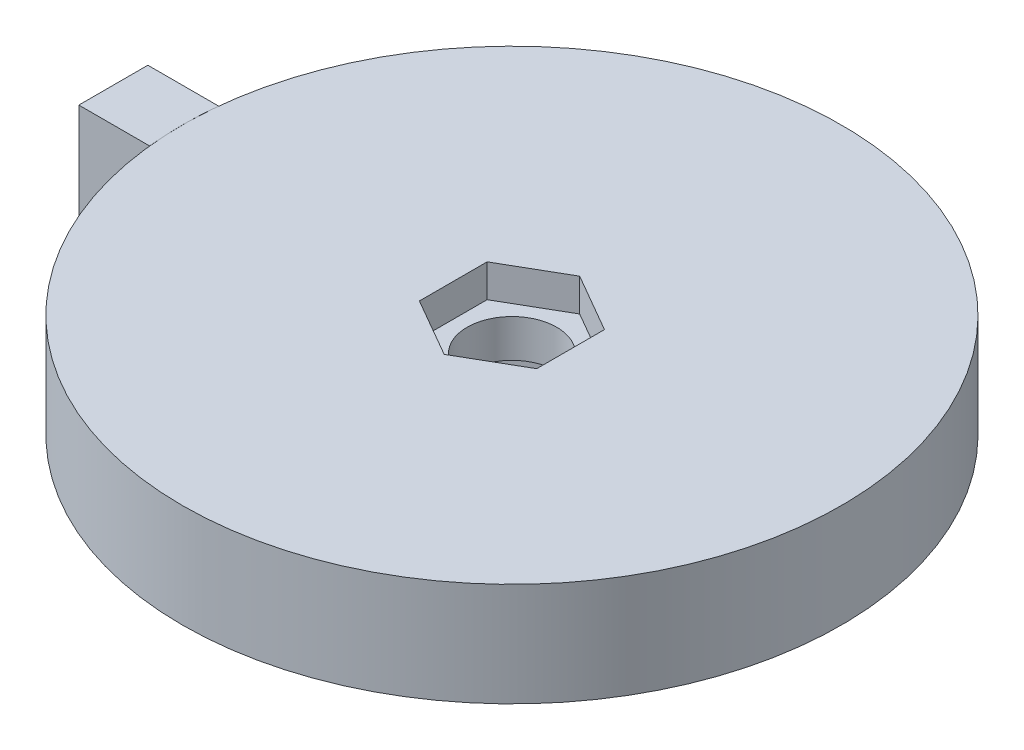
ISO-10303-21;
HEADER;
FILE_DESCRIPTION(('STEP AP214'),'2;1');
FILE_NAME('part.step','',(''),(''),'','','');
FILE_SCHEMA(('AUTOMOTIVE_DESIGN { 1 0 10303 214 1 1 1 1 }'));
ENDSEC;
DATA;
#1=APPLICATION_CONTEXT('core data for automotive mechanical design processes');
#2=APPLICATION_PROTOCOL_DEFINITION('international standard','automotive_design',2000,#1);
#3=PRODUCT_CONTEXT('',#1,'mechanical');
#4=PRODUCT('Part','Part','',(#3));
#5=PRODUCT_RELATED_PRODUCT_CATEGORY('part','',(#4));
#6=PRODUCT_DEFINITION_FORMATION('','',#4);
#7=PRODUCT_DEFINITION_CONTEXT('part definition',#1,'design');
#8=PRODUCT_DEFINITION('design','',#6,#7);
#9=PRODUCT_DEFINITION_SHAPE('','',#8);
#10=(LENGTH_UNIT() NAMED_UNIT(*) SI_UNIT(.MILLI.,.METRE.));
#11=(NAMED_UNIT(*) PLANE_ANGLE_UNIT() SI_UNIT($,.RADIAN.));
#12=(NAMED_UNIT(*) SI_UNIT($,.STERADIAN.) SOLID_ANGLE_UNIT());
#13=UNCERTAINTY_MEASURE_WITH_UNIT(LENGTH_MEASURE(1.E-05),#10,'distance_accuracy_value','');
#14=(GEOMETRIC_REPRESENTATION_CONTEXT(3) GLOBAL_UNCERTAINTY_ASSIGNED_CONTEXT((#13)) GLOBAL_UNIT_ASSIGNED_CONTEXT((#10,
#11,#12)) REPRESENTATION_CONTEXT('',''));
#15=CARTESIAN_POINT('',(0.,0.,0.));
#16=DIRECTION('',(0.,0.,1.));
#17=DIRECTION('',(1.,0.,0.));
#18=AXIS2_PLACEMENT_3D('',#15,#16,#17);
#19=CARTESIAN_POINT('',(-57.75,15.,0.));
#20=DIRECTION('',(-1.,0.,0.));
#21=DIRECTION('',(0.,0.,1.));
#22=AXIS2_PLACEMENT_3D('',#19,#20,#21);
#23=PLANE('',#22);
#24=DIRECTION('',(0.,0.,-1.));
#25=VECTOR('',#24,1.);
#26=CARTESIAN_POINT('',(-57.75,0.,0.));
#27=LINE('',#26,#25);
#28=CARTESIAN_POINT('',(-57.75,0.,5.));
#29=VERTEX_POINT('',#28);
#30=CARTESIAN_POINT('',(-57.75,0.,-5.));
#31=VERTEX_POINT('',#30);
#32=EDGE_CURVE('E111',#29,#31,#27,.T.);
#33=ORIENTED_EDGE('',*,*,#32,.F.);
#34=DIRECTION('',(0.,-1.,0.));
#35=VECTOR('',#34,1.);
#36=CARTESIAN_POINT('',(-57.75,15.,5.));
#37=LINE('',#36,#35);
#38=CARTESIAN_POINT('',(-57.75,15.,5.));
#39=VERTEX_POINT('',#38);
#40=EDGE_CURVE('E12',#39,#29,#37,.T.);
#41=ORIENTED_EDGE('',*,*,#40,.F.);
#42=DIRECTION('',(0.,0.,-1.));
#43=VECTOR('',#42,1.);
#44=CARTESIAN_POINT('',(-57.75,15.,0.));
#45=LINE('',#44,#43);
#46=CARTESIAN_POINT('',(-57.75,15.,-5.));
#47=VERTEX_POINT('',#46);
#48=EDGE_CURVE('E106',#39,#47,#45,.T.);
#49=ORIENTED_EDGE('',*,*,#48,.T.);
#50=DIRECTION('',(0.,-1.,0.));
#51=VECTOR('',#50,1.);
#52=CARTESIAN_POINT('',(-57.75,15.,-5.));
#53=LINE('',#52,#51);
#54=EDGE_CURVE('E49',#47,#31,#53,.T.);
#55=ORIENTED_EDGE('',*,*,#54,.T.);
#56=EDGE_LOOP('',(#33,#41,#49,#55));
#57=FACE_BOUND('',#56,.T.);
#58=ADVANCED_FACE('F46',(#57),#23,.T.);
#59=CARTESIAN_POINT('',(0.,15.,5.00000000000001));
#60=DIRECTION('',(0.,0.,-1.));
#61=DIRECTION('',(-1.,0.,0.));
#62=AXIS2_PLACEMENT_3D('',#59,#60,#61);
#63=PLANE('',#62);
#64=DIRECTION('',(1.,0.,0.));
#65=VECTOR('',#64,1.);
#66=CARTESIAN_POINT('',(0.,0.,5.00000000000001));
#67=LINE('',#66,#65);
#68=CARTESIAN_POINT('',(-47.4874983548302,0.,5.));
#69=VERTEX_POINT('',#68);
#70=EDGE_CURVE('E79',#29,#69,#67,.T.);
#71=ORIENTED_EDGE('',*,*,#70,.T.);
#72=DIRECTION('',(0.,-1.,0.));
#73=VECTOR('',#72,1.);
#74=CARTESIAN_POINT('',(-47.4874983548302,15.,5.));
#75=LINE('',#74,#73);
#76=CARTESIAN_POINT('',(-47.4874983548302,15.,5.));
#77=VERTEX_POINT('',#76);
#78=EDGE_CURVE('E55',#77,#69,#75,.T.);
#79=ORIENTED_EDGE('',*,*,#78,.F.);
#80=DIRECTION('',(1.,0.,0.));
#81=VECTOR('',#80,1.);
#82=CARTESIAN_POINT('',(0.,15.,5.00000000000001));
#83=LINE('',#82,#81);
#84=EDGE_CURVE('E96',#39,#77,#83,.T.);
#85=ORIENTED_EDGE('',*,*,#84,.F.);
#86=ORIENTED_EDGE('',*,*,#40,.T.);
#87=EDGE_LOOP('',(#71,#79,#85,#86));
#88=FACE_BOUND('',#87,.T.);
#89=ADVANCED_FACE('F121',(#88),#63,.F.);
#90=CARTESIAN_POINT('',(0.,15.,0.));
#91=DIRECTION('',(0.,-1.,0.));
#92=DIRECTION('',(0.,0.,-1.));
#93=AXIS2_PLACEMENT_3D('',#90,#91,#92);
#94=CYLINDRICAL_SURFACE('',#93,47.75);
#95=CARTESIAN_POINT('',(0.,0.,0.));
#96=DIRECTION('',(0.,-1.,0.));
#97=DIRECTION('',(0.,0.,-1.));
#98=AXIS2_PLACEMENT_3D('',#95,#96,#97);
#99=CIRCLE('',#98,47.75);
#100=CARTESIAN_POINT('',(-47.4874983548302,0.,-5.));
#101=VERTEX_POINT('',#100);
#102=EDGE_CURVE('E103',#69,#101,#99,.T.);
#103=ORIENTED_EDGE('',*,*,#102,.T.);
#104=DIRECTION('',(0.,-1.,0.));
#105=VECTOR('',#104,1.);
#106=CARTESIAN_POINT('',(-47.4874983548302,15.,-5.));
#107=LINE('',#106,#105);
#108=CARTESIAN_POINT('',(-47.4874983548302,15.,-5.));
#109=VERTEX_POINT('',#108);
#110=EDGE_CURVE('E100',#109,#101,#107,.T.);
#111=ORIENTED_EDGE('',*,*,#110,.F.);
#112=CARTESIAN_POINT('',(0.,15.,0.));
#113=DIRECTION('',(0.,-1.,0.));
#114=DIRECTION('',(0.,0.,-1.));
#115=AXIS2_PLACEMENT_3D('',#112,#113,#114);
#116=CIRCLE('',#115,47.75);
#117=EDGE_CURVE('E91',#77,#109,#116,.T.);
#118=ORIENTED_EDGE('',*,*,#117,.F.);
#119=ORIENTED_EDGE('',*,*,#78,.T.);
#120=EDGE_LOOP('',(#103,#111,#118,#119));
#121=FACE_BOUND('',#120,.T.);
#122=ADVANCED_FACE('F101',(#121),#94,.F.);
#123=CARTESIAN_POINT('',(0.,15.,-5.00000000000001));
#124=DIRECTION('',(0.,0.,-1.));
#125=DIRECTION('',(-1.,0.,0.));
#126=AXIS2_PLACEMENT_3D('',#123,#124,#125);
#127=PLANE('',#126);
#128=DIRECTION('',(1.,0.,0.));
#129=VECTOR('',#128,1.);
#130=CARTESIAN_POINT('',(0.,0.,-5.00000000000001));
#131=LINE('',#130,#129);
#132=EDGE_CURVE('E114',#31,#101,#131,.T.);
#133=ORIENTED_EDGE('',*,*,#132,.F.);
#134=ORIENTED_EDGE('',*,*,#54,.F.);
#135=DIRECTION('',(1.,0.,0.));
#136=VECTOR('',#135,1.);
#137=CARTESIAN_POINT('',(0.,15.,-5.00000000000001));
#138=LINE('',#137,#136);
#139=EDGE_CURVE('E95',#47,#109,#138,.T.);
#140=ORIENTED_EDGE('',*,*,#139,.T.);
#141=ORIENTED_EDGE('',*,*,#110,.T.);
#142=EDGE_LOOP('',(#133,#134,#140,#141));
#143=FACE_BOUND('',#142,.T.);
#144=ADVANCED_FACE('F105',(#143),#127,.T.);
#145=CARTESIAN_POINT('',(0.,15.,0.));
#146=DIRECTION('',(0.,-1.,0.));
#147=DIRECTION('',(0.,0.,-1.));
#148=AXIS2_PLACEMENT_3D('',#145,#146,#147);
#149=PLANE('',#148);
#150=ORIENTED_EDGE('',*,*,#48,.F.);
#151=ORIENTED_EDGE('',*,*,#84,.T.);
#152=ORIENTED_EDGE('',*,*,#117,.T.);
#153=ORIENTED_EDGE('',*,*,#139,.F.);
#154=EDGE_LOOP('',(#150,#151,#152,#153));
#155=FACE_BOUND('',#154,.T.);
#156=ADVANCED_FACE('F94',(#155),#149,.F.);
#157=CARTESIAN_POINT('',(0.,0.,0.));
#158=DIRECTION('',(0.,-1.,0.));
#159=DIRECTION('',(0.,0.,-1.));
#160=AXIS2_PLACEMENT_3D('',#157,#158,#159);
#161=PLANE('',#160);
#162=ORIENTED_EDGE('',*,*,#32,.T.);
#163=ORIENTED_EDGE('',*,*,#132,.T.);
#164=ORIENTED_EDGE('',*,*,#102,.F.);
#165=ORIENTED_EDGE('',*,*,#70,.F.);
#166=EDGE_LOOP('',(#162,#163,#164,#165));
#167=FACE_BOUND('',#166,.T.);
#168=ADVANCED_FACE('F119',(#167),#161,.T.);
#169=CLOSED_SHELL('',(#58,#89,#122,#144,#156,#168));
#170=MANIFOLD_SOLID_BREP('B2',#169);
#171=CARTESIAN_POINT('',(0.,0.,0.));
#172=DIRECTION('',(0.,1.,0.));
#173=DIRECTION('',(0.,0.,1.));
#174=AXIS2_PLACEMENT_3D('',#171,#172,#173);
#175=PLANE('',#174);
#176=CARTESIAN_POINT('',(0.,0.,0.));
#177=DIRECTION('',(0.,1.,0.));
#178=DIRECTION('',(0.,0.,1.));
#179=AXIS2_PLACEMENT_3D('',#176,#177,#178);
#180=CIRCLE('',#179,47.75);
#181=CARTESIAN_POINT('',(0.,0.,47.75));
#182=VERTEX_POINT('',#181);
#183=EDGE_CURVE('E188',#182,#182,#180,.T.);
#184=ORIENTED_EDGE('',*,*,#183,.F.);
#185=EDGE_LOOP('',(#184));
#186=FACE_BOUND('',#185,.T.);
#187=DIRECTION('',(-0.866025403784439,0.,0.5));
#188=VECTOR('',#187,1.);
#189=CARTESIAN_POINT('',(0.,0.,-9.81495457622362));
#190=LINE('',#189,#188);
#191=CARTESIAN_POINT('',(0.,0.,-9.81495457622362));
#192=VERTEX_POINT('',#191);
#193=CARTESIAN_POINT('',(-8.5,0.,-4.90747728811182));
#194=VERTEX_POINT('',#193);
#195=EDGE_CURVE('E196',#192,#194,#190,.T.);
#196=ORIENTED_EDGE('',*,*,#195,.T.);
#197=DIRECTION('',(0.,0.,1.));
#198=VECTOR('',#197,1.);
#199=CARTESIAN_POINT('',(-8.5,0.,-4.90747728811182));
#200=LINE('',#199,#198);
#201=CARTESIAN_POINT('',(-8.5,0.,4.90747728811182));
#202=VERTEX_POINT('',#201);
#203=EDGE_CURVE('E292',#194,#202,#200,.T.);
#204=ORIENTED_EDGE('',*,*,#203,.T.);
#205=DIRECTION('',(0.866025403784438,0.,0.5));
#206=VECTOR('',#205,1.);
#207=CARTESIAN_POINT('',(-8.5,0.,4.90747728811182));
#208=LINE('',#207,#206);
#209=CARTESIAN_POINT('',(0.,0.,9.81495457622364));
#210=VERTEX_POINT('',#209);
#211=EDGE_CURVE('E384',#202,#210,#208,.T.);
#212=ORIENTED_EDGE('',*,*,#211,.T.);
#213=DIRECTION('',(0.866025403784438,0.,-0.5));
#214=VECTOR('',#213,1.);
#215=CARTESIAN_POINT('',(0.,0.,9.81495457622364));
#216=LINE('',#215,#214);
#217=CARTESIAN_POINT('',(8.5,0.,4.90747728811182));
#218=VERTEX_POINT('',#217);
#219=EDGE_CURVE('E391',#210,#218,#216,.T.);
#220=ORIENTED_EDGE('',*,*,#219,.T.);
#221=DIRECTION('',(0.,0.,-1.));
#222=VECTOR('',#221,1.);
#223=CARTESIAN_POINT('',(8.5,0.,4.90747728811182));
#224=LINE('',#223,#222);
#225=CARTESIAN_POINT('',(8.5,0.,-4.90747728811179));
#226=VERTEX_POINT('',#225);
#227=EDGE_CURVE('E394',#218,#226,#224,.T.);
#228=ORIENTED_EDGE('',*,*,#227,.T.);
#229=DIRECTION('',(-0.866025403784439,0.,-0.5));
#230=VECTOR('',#229,1.);
#231=CARTESIAN_POINT('',(8.5,0.,-4.90747728811179));
#232=LINE('',#231,#230);
#233=EDGE_CURVE('E288',#226,#192,#232,.T.);
#234=ORIENTED_EDGE('',*,*,#233,.T.);
#235=EDGE_LOOP('',(#196,#204,#212,#220,#228,#234));
#236=FACE_BOUND('',#235,.T.);
#237=ADVANCED_FACE('F179',(#186,#236),#175,.F.);
#238=CARTESIAN_POINT('',(0.,0.,0.));
#239=DIRECTION('',(0.,1.,0.));
#240=DIRECTION('',(0.,0.,1.));
#241=AXIS2_PLACEMENT_3D('',#238,#239,#240);
#242=CYLINDRICAL_SURFACE('',#241,6.5);
#243=CARTESIAN_POINT('',(0.,4.75,0.));
#244=DIRECTION('',(0.,1.,0.));
#245=DIRECTION('',(0.,0.,1.));
#246=AXIS2_PLACEMENT_3D('',#243,#244,#245);
#247=CIRCLE('',#246,6.5);
#248=CARTESIAN_POINT('',(0.,4.75,6.5));
#249=VERTEX_POINT('',#248);
#250=EDGE_CURVE('E183',#249,#249,#247,.F.);
#251=ORIENTED_EDGE('',*,*,#250,.T.);
#252=EDGE_LOOP('',(#251));
#253=FACE_BOUND('',#252,.T.);
#254=CARTESIAN_POINT('',(0.,10.25,0.));
#255=DIRECTION('',(0.,1.,0.));
#256=DIRECTION('',(0.,0.,1.));
#257=AXIS2_PLACEMENT_3D('',#254,#255,#256);
#258=CIRCLE('',#257,6.5);
#259=CARTESIAN_POINT('',(0.,10.25,6.5));
#260=VERTEX_POINT('',#259);
#261=EDGE_CURVE('E331',#260,#260,#258,.F.);
#262=ORIENTED_EDGE('',*,*,#261,.F.);
#263=EDGE_LOOP('',(#262));
#264=FACE_BOUND('',#263,.T.);
#265=ADVANCED_FACE('F347',(#253,#264),#242,.F.);
#266=CARTESIAN_POINT('',(0.,15.,0.));
#267=DIRECTION('',(0.,-1.,0.));
#268=DIRECTION('',(0.,0.,-1.));
#269=AXIS2_PLACEMENT_3D('',#266,#267,#268);
#270=CYLINDRICAL_SURFACE('',#269,47.75);
#271=CARTESIAN_POINT('',(0.,15.,0.));
#272=DIRECTION('',(0.,1.,0.));
#273=DIRECTION('',(0.,0.,1.));
#274=AXIS2_PLACEMENT_3D('',#271,#272,#273);
#275=CIRCLE('',#274,47.75);
#276=CARTESIAN_POINT('',(0.,15.,47.75));
#277=VERTEX_POINT('',#276);
#278=EDGE_CURVE('E44',#277,#277,#275,.T.);
#279=ORIENTED_EDGE('',*,*,#278,.F.);
#280=EDGE_LOOP('',(#279));
#281=FACE_BOUND('',#280,.T.);
#282=ORIENTED_EDGE('',*,*,#183,.T.);
#283=EDGE_LOOP('',(#282));
#284=FACE_BOUND('',#283,.T.);
#285=ADVANCED_FACE('F181',(#281,#284),#270,.T.);
#286=CARTESIAN_POINT('',(0.,15.,0.));
#287=DIRECTION('',(0.,1.,0.));
#288=DIRECTION('',(0.,0.,1.));
#289=AXIS2_PLACEMENT_3D('',#286,#287,#288);
#290=PLANE('',#289);
#291=DIRECTION('',(0.,0.,-1.));
#292=VECTOR('',#291,1.);
#293=CARTESIAN_POINT('',(8.5,15.,4.90747728811182));
#294=LINE('',#293,#292);
#295=CARTESIAN_POINT('',(8.5,15.,4.90747728811182));
#296=VERTEX_POINT('',#295);
#297=CARTESIAN_POINT('',(8.5,15.,-4.90747728811179));
#298=VERTEX_POINT('',#297);
#299=EDGE_CURVE('E305',#296,#298,#294,.T.);
#300=ORIENTED_EDGE('',*,*,#299,.F.);
#301=DIRECTION('',(0.866025403784438,0.,-0.500000000000001));
#302=VECTOR('',#301,1.);
#303=CARTESIAN_POINT('',(4.25000000000001,15.,7.36121593216773));
#304=LINE('',#303,#302);
#305=CARTESIAN_POINT('',(0.,15.,9.81495457622364));
#306=VERTEX_POINT('',#305);
#307=EDGE_CURVE('E325',#306,#296,#304,.T.);
#308=ORIENTED_EDGE('',*,*,#307,.F.);
#309=DIRECTION('',(0.866025403784439,0.,0.5));
#310=VECTOR('',#309,1.);
#311=CARTESIAN_POINT('',(-4.25,15.,7.36121593216773));
#312=LINE('',#311,#310);
#313=CARTESIAN_POINT('',(-8.5,15.,4.90747728811182));
#314=VERTEX_POINT('',#313);
#315=EDGE_CURVE('E322',#314,#306,#312,.T.);
#316=ORIENTED_EDGE('',*,*,#315,.F.);
#317=DIRECTION('',(0.,0.,1.));
#318=VECTOR('',#317,1.);
#319=CARTESIAN_POINT('',(-8.5,15.,0.));
#320=LINE('',#319,#318);
#321=CARTESIAN_POINT('',(-8.5,15.,-4.90747728811182));
#322=VERTEX_POINT('',#321);
#323=EDGE_CURVE('E319',#322,#314,#320,.T.);
#324=ORIENTED_EDGE('',*,*,#323,.F.);
#325=DIRECTION('',(-0.866025403784439,0.,0.499999999999999));
#326=VECTOR('',#325,1.);
#327=CARTESIAN_POINT('',(-4.25,15.,-7.36121593216772));
#328=LINE('',#327,#326);
#329=CARTESIAN_POINT('',(0.,15.,-9.81495457622362));
#330=VERTEX_POINT('',#329);
#331=EDGE_CURVE('E316',#330,#322,#328,.T.);
#332=ORIENTED_EDGE('',*,*,#331,.F.);
#333=DIRECTION('',(-0.866025403784439,0.,-0.5));
#334=VECTOR('',#333,1.);
#335=CARTESIAN_POINT('',(4.25000000000002,15.,-7.36121593216769));
#336=LINE('',#335,#334);
#337=EDGE_CURVE('E296',#298,#330,#336,.T.);
#338=ORIENTED_EDGE('',*,*,#337,.F.);
#339=EDGE_LOOP('',(#300,#308,#316,#324,#332,#338));
#340=FACE_BOUND('',#339,.T.);
#341=ORIENTED_EDGE('',*,*,#278,.T.);
#342=EDGE_LOOP('',(#341));
#343=FACE_BOUND('',#342,.T.);
#344=ADVANCED_FACE('F356',(#340,#343),#290,.T.);
#345=CARTESIAN_POINT('',(0.,10.25,0.));
#346=DIRECTION('',(0.,1.,0.));
#347=DIRECTION('',(0.,0.,1.));
#348=AXIS2_PLACEMENT_3D('',#345,#346,#347);
#349=PLANE('',#348);
#350=DIRECTION('',(0.,0.,-1.));
#351=VECTOR('',#350,1.);
#352=CARTESIAN_POINT('',(8.5,10.25,0.));
#353=LINE('',#352,#351);
#354=CARTESIAN_POINT('',(8.5,10.25,4.90747728811182));
#355=VERTEX_POINT('',#354);
#356=CARTESIAN_POINT('',(8.5,10.25,-4.90747728811183));
#357=VERTEX_POINT('',#356);
#358=EDGE_CURVE('E301',#355,#357,#353,.T.);
#359=ORIENTED_EDGE('',*,*,#358,.T.);
#360=DIRECTION('',(-0.866025403784442,0.,-0.499999999999994));
#361=VECTOR('',#360,1.);
#362=CARTESIAN_POINT('',(8.5,10.25,-4.90747728811183));
#363=LINE('',#362,#361);
#364=CARTESIAN_POINT('',(0.,10.25,-9.81495457622362));
#365=VERTEX_POINT('',#364);
#366=EDGE_CURVE('E304',#357,#365,#363,.T.);
#367=ORIENTED_EDGE('',*,*,#366,.T.);
#368=DIRECTION('',(-0.866025403784439,0.,0.5));
#369=VECTOR('',#368,1.);
#370=CARTESIAN_POINT('',(0.,10.25,-9.81495457622362));
#371=LINE('',#370,#369);
#372=CARTESIAN_POINT('',(-8.5,10.25,-4.90747728811182));
#373=VERTEX_POINT('',#372);
#374=EDGE_CURVE('E307',#365,#373,#371,.T.);
#375=ORIENTED_EDGE('',*,*,#374,.T.);
#376=DIRECTION('',(0.,0.,1.));
#377=VECTOR('',#376,1.);
#378=CARTESIAN_POINT('',(-8.5,10.25,-4.90747728811182));
#379=LINE('',#378,#377);
#380=CARTESIAN_POINT('',(-8.5,10.25,4.90747728811182));
#381=VERTEX_POINT('',#380);
#382=EDGE_CURVE('E309',#373,#381,#379,.T.);
#383=ORIENTED_EDGE('',*,*,#382,.T.);
#384=DIRECTION('',(0.866025403784439,0.,0.5));
#385=VECTOR('',#384,1.);
#386=CARTESIAN_POINT('',(-8.5,10.25,4.90747728811182));
#387=LINE('',#386,#385);
#388=CARTESIAN_POINT('',(0.,10.25,9.81495457622364));
#389=VERTEX_POINT('',#388);
#390=EDGE_CURVE('E311',#381,#389,#387,.T.);
#391=ORIENTED_EDGE('',*,*,#390,.T.);
#392=DIRECTION('',(0.866025403784439,0.,-0.5));
#393=VECTOR('',#392,1.);
#394=CARTESIAN_POINT('',(0.,10.25,9.81495457622364));
#395=LINE('',#394,#393);
#396=EDGE_CURVE('E313',#389,#355,#395,.T.);
#397=ORIENTED_EDGE('',*,*,#396,.T.);
#398=EDGE_LOOP('',(#359,#367,#375,#383,#391,#397));
#399=FACE_BOUND('',#398,.T.);
#400=ORIENTED_EDGE('',*,*,#261,.T.);
#401=EDGE_LOOP('',(#400));
#402=FACE_BOUND('',#401,.T.);
#403=ADVANCED_FACE('F345',(#399,#402),#349,.T.);
#404=CARTESIAN_POINT('',(8.5,10.25,4.90747728811182));
#405=DIRECTION('',(1.,0.,0.));
#406=DIRECTION('',(0.,0.,-1.));
#407=AXIS2_PLACEMENT_3D('',#404,#405,#406);
#408=PLANE('',#407);
#409=ORIENTED_EDGE('',*,*,#299,.T.);
#410=DIRECTION('',(0.,1.,0.));
#411=VECTOR('',#410,1.);
#412=CARTESIAN_POINT('',(8.5,10.25,-4.90747728811183));
#413=LINE('',#412,#411);
#414=EDGE_CURVE('E204',#357,#298,#413,.T.);
#415=ORIENTED_EDGE('',*,*,#414,.F.);
#416=ORIENTED_EDGE('',*,*,#358,.F.);
#417=DIRECTION('',(0.,1.,0.));
#418=VECTOR('',#417,1.);
#419=CARTESIAN_POINT('',(8.5,10.25,4.90747728811182));
#420=LINE('',#419,#418);
#421=EDGE_CURVE('E329',#355,#296,#420,.T.);
#422=ORIENTED_EDGE('',*,*,#421,.T.);
#423=EDGE_LOOP('',(#409,#415,#416,#422));
#424=FACE_BOUND('',#423,.T.);
#425=ADVANCED_FACE('F368',(#424),#408,.F.);
#426=CARTESIAN_POINT('',(4.25000000000001,10.25,7.36121593216773));
#427=DIRECTION('',(0.500000000000001,0.,0.866025403784438));
#428=DIRECTION('',(0.866025403784438,0.,-0.500000000000001));
#429=AXIS2_PLACEMENT_3D('',#426,#427,#428);
#430=PLANE('',#429);
#431=ORIENTED_EDGE('',*,*,#307,.T.);
#432=ORIENTED_EDGE('',*,*,#421,.F.);
#433=ORIENTED_EDGE('',*,*,#396,.F.);
#434=DIRECTION('',(0.,1.,0.));
#435=VECTOR('',#434,1.);
#436=CARTESIAN_POINT('',(0.,10.25,9.81495457622364));
#437=LINE('',#436,#435);
#438=EDGE_CURVE('E332',#389,#306,#437,.T.);
#439=ORIENTED_EDGE('',*,*,#438,.T.);
#440=EDGE_LOOP('',(#431,#432,#433,#439));
#441=FACE_BOUND('',#440,.T.);
#442=ADVANCED_FACE('F438',(#441),#430,.F.);
#443=CARTESIAN_POINT('',(-4.25,10.25,7.36121593216773));
#444=DIRECTION('',(-0.5,0.,0.866025403784439));
#445=DIRECTION('',(0.866025403784439,0.,0.5));
#446=AXIS2_PLACEMENT_3D('',#443,#444,#445);
#447=PLANE('',#446);
#448=ORIENTED_EDGE('',*,*,#315,.T.);
#449=ORIENTED_EDGE('',*,*,#438,.F.);
#450=ORIENTED_EDGE('',*,*,#390,.F.);
#451=DIRECTION('',(0.,1.,0.));
#452=VECTOR('',#451,1.);
#453=CARTESIAN_POINT('',(-8.5,10.25,4.90747728811182));
#454=LINE('',#453,#452);
#455=EDGE_CURVE('E334',#381,#314,#454,.T.);
#456=ORIENTED_EDGE('',*,*,#455,.T.);
#457=EDGE_LOOP('',(#448,#449,#450,#456));
#458=FACE_BOUND('',#457,.T.);
#459=ADVANCED_FACE('F442',(#458),#447,.F.);
#460=CARTESIAN_POINT('',(-8.5,10.25,0.));
#461=DIRECTION('',(-1.,0.,0.));
#462=DIRECTION('',(0.,0.,1.));
#463=AXIS2_PLACEMENT_3D('',#460,#461,#462);
#464=PLANE('',#463);
#465=ORIENTED_EDGE('',*,*,#323,.T.);
#466=ORIENTED_EDGE('',*,*,#455,.F.);
#467=ORIENTED_EDGE('',*,*,#382,.F.);
#468=DIRECTION('',(0.,1.,0.));
#469=VECTOR('',#468,1.);
#470=CARTESIAN_POINT('',(-8.5,10.25,-4.90747728811182));
#471=LINE('',#470,#469);
#472=EDGE_CURVE('E336',#373,#322,#471,.T.);
#473=ORIENTED_EDGE('',*,*,#472,.T.);
#474=EDGE_LOOP('',(#465,#466,#467,#473));
#475=FACE_BOUND('',#474,.T.);
#476=ADVANCED_FACE('F446',(#475),#464,.F.);
#477=CARTESIAN_POINT('',(-4.25,10.25,-7.36121593216772));
#478=DIRECTION('',(-0.499999999999999,0.,-0.866025403784439));
#479=DIRECTION('',(-0.866025403784439,0.,0.499999999999999));
#480=AXIS2_PLACEMENT_3D('',#477,#478,#479);
#481=PLANE('',#480);
#482=ORIENTED_EDGE('',*,*,#331,.T.);
#483=ORIENTED_EDGE('',*,*,#472,.F.);
#484=ORIENTED_EDGE('',*,*,#374,.F.);
#485=DIRECTION('',(0.,1.,0.));
#486=VECTOR('',#485,1.);
#487=CARTESIAN_POINT('',(0.,10.25,-9.81495457622362));
#488=LINE('',#487,#486);
#489=EDGE_CURVE('E338',#365,#330,#488,.T.);
#490=ORIENTED_EDGE('',*,*,#489,.T.);
#491=EDGE_LOOP('',(#482,#483,#484,#490));
#492=FACE_BOUND('',#491,.T.);
#493=ADVANCED_FACE('F449',(#492),#481,.F.);
#494=CARTESIAN_POINT('',(4.25000000000002,10.25,-7.36121593216769));
#495=DIRECTION('',(0.5,0.,-0.866025403784439));
#496=DIRECTION('',(-0.866025403784439,0.,-0.5));
#497=AXIS2_PLACEMENT_3D('',#494,#495,#496);
#498=PLANE('',#497);
#499=ORIENTED_EDGE('',*,*,#337,.T.);
#500=ORIENTED_EDGE('',*,*,#489,.F.);
#501=ORIENTED_EDGE('',*,*,#366,.F.);
#502=ORIENTED_EDGE('',*,*,#414,.T.);
#503=EDGE_LOOP('',(#499,#500,#501,#502));
#504=FACE_BOUND('',#503,.T.);
#505=ADVANCED_FACE('F361',(#504),#498,.F.);
#506=CARTESIAN_POINT('',(0.,4.75,0.));
#507=DIRECTION('',(0.,1.,0.));
#508=DIRECTION('',(0.,0.,1.));
#509=AXIS2_PLACEMENT_3D('',#506,#507,#508);
#510=PLANE('',#509);
#511=DIRECTION('',(-0.866025403784439,0.,0.5));
#512=VECTOR('',#511,1.);
#513=CARTESIAN_POINT('',(0.,4.75,-9.81495457622362));
#514=LINE('',#513,#512);
#515=CARTESIAN_POINT('',(0.,4.75,-9.81495457622362));
#516=VERTEX_POINT('',#515);
#517=CARTESIAN_POINT('',(-8.5,4.75,-4.90747728811182));
#518=VERTEX_POINT('',#517);
#519=EDGE_CURVE('E278',#516,#518,#514,.T.);
#520=ORIENTED_EDGE('',*,*,#519,.F.);
#521=DIRECTION('',(-0.866025403784439,0.,-0.5));
#522=VECTOR('',#521,1.);
#523=CARTESIAN_POINT('',(8.5,4.75,-4.90747728811179));
#524=LINE('',#523,#522);
#525=CARTESIAN_POINT('',(8.5,4.75,-4.90747728811179));
#526=VERTEX_POINT('',#525);
#527=EDGE_CURVE('E387',#526,#516,#524,.T.);
#528=ORIENTED_EDGE('',*,*,#527,.F.);
#529=DIRECTION('',(0.,0.,-1.));
#530=VECTOR('',#529,1.);
#531=CARTESIAN_POINT('',(8.5,4.75,4.90747728811182));
#532=LINE('',#531,#530);
#533=CARTESIAN_POINT('',(8.5,4.75,4.90747728811182));
#534=VERTEX_POINT('',#533);
#535=EDGE_CURVE('E414',#534,#526,#532,.T.);
#536=ORIENTED_EDGE('',*,*,#535,.F.);
#537=DIRECTION('',(0.866025403784438,0.,-0.5));
#538=VECTOR('',#537,1.);
#539=CARTESIAN_POINT('',(0.,4.75,9.81495457622364));
#540=LINE('',#539,#538);
#541=CARTESIAN_POINT('',(0.,4.75,9.81495457622364));
#542=VERTEX_POINT('',#541);
#543=EDGE_CURVE('E417',#542,#534,#540,.T.);
#544=ORIENTED_EDGE('',*,*,#543,.F.);
#545=DIRECTION('',(0.866025403784438,0.,0.5));
#546=VECTOR('',#545,1.);
#547=CARTESIAN_POINT('',(-8.5,4.75,4.90747728811182));
#548=LINE('',#547,#546);
#549=CARTESIAN_POINT('',(-8.5,4.75,4.90747728811182));
#550=VERTEX_POINT('',#549);
#551=EDGE_CURVE('E280',#550,#542,#548,.T.);
#552=ORIENTED_EDGE('',*,*,#551,.F.);
#553=DIRECTION('',(0.,0.,1.));
#554=VECTOR('',#553,1.);
#555=CARTESIAN_POINT('',(-8.5,4.75,-4.90747728811182));
#556=LINE('',#555,#554);
#557=EDGE_CURVE('E273',#518,#550,#556,.T.);
#558=ORIENTED_EDGE('',*,*,#557,.F.);
#559=EDGE_LOOP('',(#520,#528,#536,#544,#552,#558));
#560=FACE_BOUND('',#559,.T.);
#561=ORIENTED_EDGE('',*,*,#250,.F.);
#562=EDGE_LOOP('',(#561));
#563=FACE_BOUND('',#562,.T.);
#564=ADVANCED_FACE('F275',(#560,#563),#510,.F.);
#565=CARTESIAN_POINT('',(0.,4.75,-9.81495457622362));
#566=DIRECTION('',(0.5,0.,0.866025403784439));
#567=DIRECTION('',(0.866025403784439,0.,-0.5));
#568=AXIS2_PLACEMENT_3D('',#565,#566,#567);
#569=PLANE('',#568);
#570=ORIENTED_EDGE('',*,*,#195,.F.);
#571=DIRECTION('',(0.,-1.,0.));
#572=VECTOR('',#571,1.);
#573=CARTESIAN_POINT('',(0.,4.75,-9.81495457622362));
#574=LINE('',#573,#572);
#575=EDGE_CURVE('E287',#516,#192,#574,.T.);
#576=ORIENTED_EDGE('',*,*,#575,.F.);
#577=ORIENTED_EDGE('',*,*,#519,.T.);
#578=DIRECTION('',(0.,-1.,0.));
#579=VECTOR('',#578,1.);
#580=CARTESIAN_POINT('',(-8.5,4.75,-4.90747728811182));
#581=LINE('',#580,#579);
#582=EDGE_CURVE('E286',#518,#194,#581,.T.);
#583=ORIENTED_EDGE('',*,*,#582,.T.);
#584=EDGE_LOOP('',(#570,#576,#577,#583));
#585=FACE_BOUND('',#584,.T.);
#586=ADVANCED_FACE('F285',(#585),#569,.T.);
#587=CARTESIAN_POINT('',(-8.5,4.75,-4.90747728811182));
#588=DIRECTION('',(1.,0.,0.));
#589=DIRECTION('',(0.,0.,-1.));
#590=AXIS2_PLACEMENT_3D('',#587,#588,#589);
#591=PLANE('',#590);
#592=ORIENTED_EDGE('',*,*,#203,.F.);
#593=ORIENTED_EDGE('',*,*,#582,.F.);
#594=ORIENTED_EDGE('',*,*,#557,.T.);
#595=DIRECTION('',(0.,-1.,0.));
#596=VECTOR('',#595,1.);
#597=CARTESIAN_POINT('',(-8.5,4.75,4.90747728811182));
#598=LINE('',#597,#596);
#599=EDGE_CURVE('E293',#550,#202,#598,.T.);
#600=ORIENTED_EDGE('',*,*,#599,.T.);
#601=EDGE_LOOP('',(#592,#593,#594,#600));
#602=FACE_BOUND('',#601,.T.);
#603=ADVANCED_FACE('F290',(#602),#591,.T.);
#604=CARTESIAN_POINT('',(-8.5,4.75,4.90747728811182));
#605=DIRECTION('',(0.5,0.,-0.866025403784439));
#606=DIRECTION('',(-0.866025403784439,0.,-0.5));
#607=AXIS2_PLACEMENT_3D('',#604,#605,#606);
#608=PLANE('',#607);
#609=ORIENTED_EDGE('',*,*,#211,.F.);
#610=ORIENTED_EDGE('',*,*,#599,.F.);
#611=ORIENTED_EDGE('',*,*,#551,.T.);
#612=DIRECTION('',(0.,-1.,0.));
#613=VECTOR('',#612,1.);
#614=CARTESIAN_POINT('',(0.,4.75,9.81495457622364));
#615=LINE('',#614,#613);
#616=EDGE_CURVE('E297',#542,#210,#615,.T.);
#617=ORIENTED_EDGE('',*,*,#616,.T.);
#618=EDGE_LOOP('',(#609,#610,#611,#617));
#619=FACE_BOUND('',#618,.T.);
#620=ADVANCED_FACE('F405',(#619),#608,.T.);
#621=CARTESIAN_POINT('',(0.,4.75,9.81495457622364));
#622=DIRECTION('',(-0.5,0.,-0.866025403784438));
#623=DIRECTION('',(-0.866025403784439,0.,0.5));
#624=AXIS2_PLACEMENT_3D('',#621,#622,#623);
#625=PLANE('',#624);
#626=ORIENTED_EDGE('',*,*,#219,.F.);
#627=ORIENTED_EDGE('',*,*,#616,.F.);
#628=ORIENTED_EDGE('',*,*,#543,.T.);
#629=DIRECTION('',(0.,-1.,0.));
#630=VECTOR('',#629,1.);
#631=CARTESIAN_POINT('',(8.5,4.75,4.90747728811182));
#632=LINE('',#631,#630);
#633=EDGE_CURVE('E400',#534,#218,#632,.T.);
#634=ORIENTED_EDGE('',*,*,#633,.T.);
#635=EDGE_LOOP('',(#626,#627,#628,#634));
#636=FACE_BOUND('',#635,.T.);
#637=ADVANCED_FACE('F407',(#636),#625,.T.);
#638=CARTESIAN_POINT('',(8.5,4.75,4.90747728811182));
#639=DIRECTION('',(-1.,0.,0.));
#640=DIRECTION('',(0.,0.,1.));
#641=AXIS2_PLACEMENT_3D('',#638,#639,#640);
#642=PLANE('',#641);
#643=ORIENTED_EDGE('',*,*,#227,.F.);
#644=ORIENTED_EDGE('',*,*,#633,.F.);
#645=ORIENTED_EDGE('',*,*,#535,.T.);
#646=DIRECTION('',(0.,-1.,0.));
#647=VECTOR('',#646,1.);
#648=CARTESIAN_POINT('',(8.5,4.75,-4.90747728811179));
#649=LINE('',#648,#647);
#650=EDGE_CURVE('E398',#526,#226,#649,.T.);
#651=ORIENTED_EDGE('',*,*,#650,.T.);
#652=EDGE_LOOP('',(#643,#644,#645,#651));
#653=FACE_BOUND('',#652,.T.);
#654=ADVANCED_FACE('F411',(#653),#642,.T.);
#655=CARTESIAN_POINT('',(8.5,4.75,-4.90747728811179));
#656=DIRECTION('',(-0.5,0.,0.866025403784439));
#657=DIRECTION('',(0.866025403784439,0.,0.5));
#658=AXIS2_PLACEMENT_3D('',#655,#656,#657);
#659=PLANE('',#658);
#660=ORIENTED_EDGE('',*,*,#233,.F.);
#661=ORIENTED_EDGE('',*,*,#650,.F.);
#662=ORIENTED_EDGE('',*,*,#527,.T.);
#663=ORIENTED_EDGE('',*,*,#575,.T.);
#664=EDGE_LOOP('',(#660,#661,#662,#663));
#665=FACE_BOUND('',#664,.T.);
#666=ADVANCED_FACE('F416',(#665),#659,.T.);
#667=CLOSED_SHELL('',(#237,#265,#285,#344,#403,#425,#442,#459,#476,#493,#505,#564,#586,#603,
#620,#637,#654,#666));
#668=MANIFOLD_SOLID_BREP('B6',#667);
#669=ADVANCED_BREP_SHAPE_REPRESENTATION('',(#18,#170,#668),#14);
#670=SHAPE_DEFINITION_REPRESENTATION(#9,#669);
ENDSEC;
END-ISO-10303-21;
